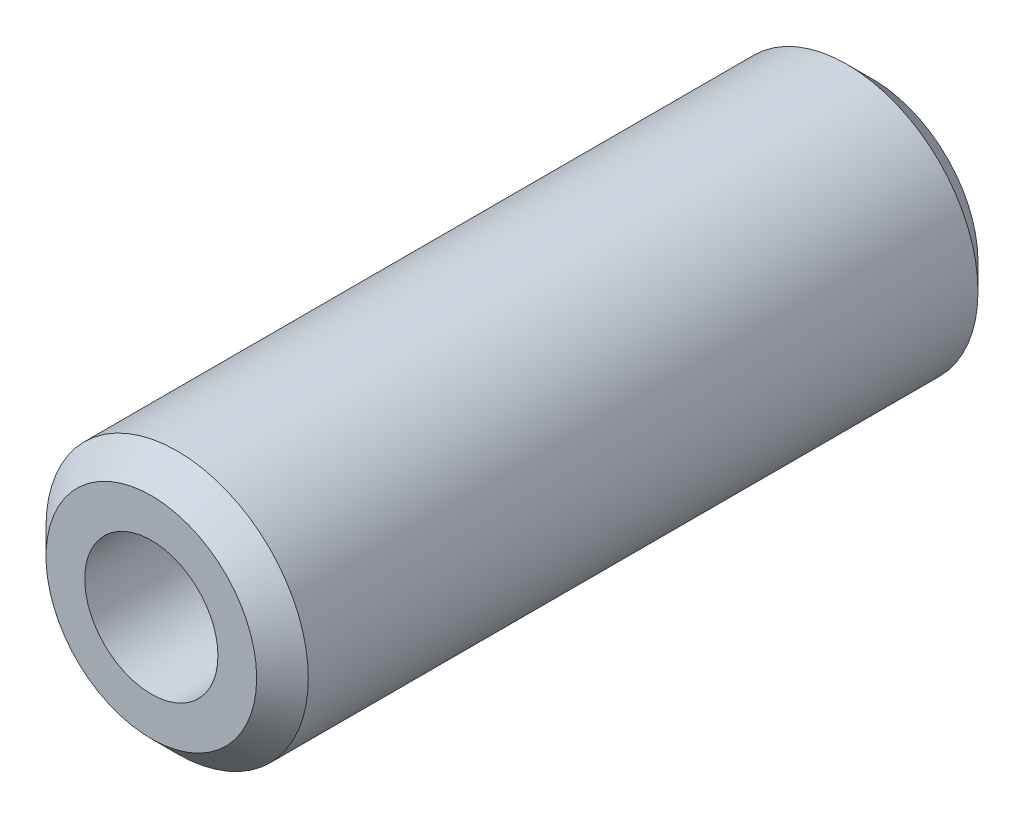
ISO-10303-21;
HEADER;
FILE_DESCRIPTION(('STEP AP214'),'2;1');
FILE_NAME('part.step','',(''),(''),'','','');
FILE_SCHEMA(('AUTOMOTIVE_DESIGN { 1 0 10303 214 1 1 1 1 }'));
ENDSEC;
DATA;
#1=APPLICATION_CONTEXT('core data for automotive mechanical design processes');
#2=APPLICATION_PROTOCOL_DEFINITION('international standard','automotive_design',2000,#1);
#3=PRODUCT_CONTEXT('',#1,'mechanical');
#4=PRODUCT('Part','Part','',(#3));
#5=PRODUCT_RELATED_PRODUCT_CATEGORY('part','',(#4));
#6=PRODUCT_DEFINITION_FORMATION('','',#4);
#7=PRODUCT_DEFINITION_CONTEXT('part definition',#1,'design');
#8=PRODUCT_DEFINITION('design','',#6,#7);
#9=PRODUCT_DEFINITION_SHAPE('','',#8);
#10=(LENGTH_UNIT() NAMED_UNIT(*) SI_UNIT(.MILLI.,.METRE.));
#11=(NAMED_UNIT(*) PLANE_ANGLE_UNIT() SI_UNIT($,.RADIAN.));
#12=(NAMED_UNIT(*) SI_UNIT($,.STERADIAN.) SOLID_ANGLE_UNIT());
#13=UNCERTAINTY_MEASURE_WITH_UNIT(LENGTH_MEASURE(1.E-05),#10,'distance_accuracy_value','');
#14=(GEOMETRIC_REPRESENTATION_CONTEXT(3) GLOBAL_UNCERTAINTY_ASSIGNED_CONTEXT((#13)) GLOBAL_UNIT_ASSIGNED_CONTEXT((#10,
#11,#12)) REPRESENTATION_CONTEXT('',''));
#15=CARTESIAN_POINT('',(0.,0.,0.));
#16=DIRECTION('',(0.,0.,1.));
#17=DIRECTION('',(1.,0.,0.));
#18=AXIS2_PLACEMENT_3D('',#15,#16,#17);
#19=CARTESIAN_POINT('',(0.,0.,34.925));
#20=DIRECTION('',(0.,0.,1.));
#21=DIRECTION('',(1.,0.,0.));
#22=AXIS2_PLACEMENT_3D('',#19,#20,#21);
#23=PLANE('',#22);
#24=CARTESIAN_POINT('',(0.,0.,34.925));
#25=DIRECTION('',(0.,0.,1.));
#26=DIRECTION('',(1.,0.,0.));
#27=AXIS2_PLACEMENT_3D('',#24,#25,#26);
#28=CIRCLE('',#27,10.2);
#29=CARTESIAN_POINT('',(10.2,0.,34.925));
#30=VERTEX_POINT('',#29);
#31=EDGE_CURVE('E10',#30,#30,#28,.T.);
#32=ORIENTED_EDGE('',*,*,#31,.T.);
#33=EDGE_LOOP('',(#32));
#34=FACE_BOUND('',#33,.T.);
#35=CARTESIAN_POINT('',(0.,0.,34.925));
#36=DIRECTION('',(0.,0.,1.));
#37=DIRECTION('',(1.,0.,0.));
#38=AXIS2_PLACEMENT_3D('',#35,#36,#37);
#39=CIRCLE('',#38,6.45);
#40=CARTESIAN_POINT('',(6.45,0.,34.925));
#41=VERTEX_POINT('',#40);
#42=EDGE_CURVE('E72',#41,#41,#39,.T.);
#43=ORIENTED_EDGE('',*,*,#42,.F.);
#44=EDGE_LOOP('',(#43));
#45=FACE_BOUND('',#44,.T.);
#46=ADVANCED_FACE('F45',(#34,#45),#23,.T.);
#47=CARTESIAN_POINT('',(0.,0.,-34.925));
#48=DIRECTION('',(0.,0.,1.));
#49=DIRECTION('',(1.,0.,0.));
#50=AXIS2_PLACEMENT_3D('',#47,#48,#49);
#51=PLANE('',#50);
#52=CARTESIAN_POINT('',(0.,0.,-34.925));
#53=DIRECTION('',(0.,0.,1.));
#54=DIRECTION('',(1.,0.,0.));
#55=AXIS2_PLACEMENT_3D('',#52,#53,#54);
#56=CIRCLE('',#55,10.2);
#57=CARTESIAN_POINT('',(10.2,0.,-34.925));
#58=VERTEX_POINT('',#57);
#59=EDGE_CURVE('E54',#58,#58,#56,.F.);
#60=ORIENTED_EDGE('',*,*,#59,.T.);
#61=EDGE_LOOP('',(#60));
#62=FACE_BOUND('',#61,.T.);
#63=CARTESIAN_POINT('',(0.,0.,-34.925));
#64=DIRECTION('',(0.,0.,1.));
#65=DIRECTION('',(1.,0.,0.));
#66=AXIS2_PLACEMENT_3D('',#63,#64,#65);
#67=CIRCLE('',#66,6.45);
#68=CARTESIAN_POINT('',(6.45,0.,-34.925));
#69=VERTEX_POINT('',#68);
#70=EDGE_CURVE('E73',#69,#69,#67,.T.);
#71=ORIENTED_EDGE('',*,*,#70,.T.);
#72=EDGE_LOOP('',(#71));
#73=FACE_BOUND('',#72,.T.);
#74=ADVANCED_FACE('F86',(#62,#73),#51,.F.);
#75=CARTESIAN_POINT('',(0.,0.,34.925));
#76=DIRECTION('',(0.,0.,-1.));
#77=DIRECTION('',(-1.,0.,0.));
#78=AXIS2_PLACEMENT_3D('',#75,#76,#77);
#79=CYLINDRICAL_SURFACE('',#78,12.7);
#80=CARTESIAN_POINT('',(0.,0.,-32.425));
#81=DIRECTION('',(0.,0.,1.));
#82=DIRECTION('',(1.,0.,0.));
#83=AXIS2_PLACEMENT_3D('',#80,#81,#82);
#84=CIRCLE('',#83,12.7);
#85=CARTESIAN_POINT('',(12.7,0.,-32.425));
#86=VERTEX_POINT('',#85);
#87=EDGE_CURVE('E60',#86,#86,#84,.T.);
#88=ORIENTED_EDGE('',*,*,#87,.T.);
#89=EDGE_LOOP('',(#88));
#90=FACE_BOUND('',#89,.T.);
#91=CARTESIAN_POINT('',(0.,0.,32.425));
#92=DIRECTION('',(0.,0.,1.));
#93=DIRECTION('',(1.,0.,0.));
#94=AXIS2_PLACEMENT_3D('',#91,#92,#93);
#95=CIRCLE('',#94,12.7);
#96=CARTESIAN_POINT('',(12.7,0.,32.425));
#97=VERTEX_POINT('',#96);
#98=EDGE_CURVE('E66',#97,#97,#95,.F.);
#99=ORIENTED_EDGE('',*,*,#98,.T.);
#100=EDGE_LOOP('',(#99));
#101=FACE_BOUND('',#100,.T.);
#102=ADVANCED_FACE('F91',(#90,#101),#79,.T.);
#103=CARTESIAN_POINT('',(0.,0.,34.925));
#104=DIRECTION('',(0.,0.,-1.));
#105=DIRECTION('',(-1.,0.,0.));
#106=AXIS2_PLACEMENT_3D('',#103,#104,#105);
#107=CYLINDRICAL_SURFACE('',#106,6.45);
#108=ORIENTED_EDGE('',*,*,#42,.T.);
#109=EDGE_LOOP('',(#108));
#110=FACE_BOUND('',#109,.T.);
#111=ORIENTED_EDGE('',*,*,#70,.F.);
#112=EDGE_LOOP('',(#111));
#113=FACE_BOUND('',#112,.T.);
#114=ADVANCED_FACE('F82',(#110,#113),#107,.F.);
#115=CARTESIAN_POINT('',(0.,0.,-32.425));
#116=DIRECTION('',(0.,0.,1.));
#117=DIRECTION('',(1.,0.,0.));
#118=AXIS2_PLACEMENT_3D('',#115,#116,#117);
#119=CONICAL_SURFACE('',#118,12.7,0.785398163397449);
#120=ORIENTED_EDGE('',*,*,#59,.F.);
#121=EDGE_LOOP('',(#120));
#122=FACE_BOUND('',#121,.T.);
#123=ORIENTED_EDGE('',*,*,#87,.F.);
#124=EDGE_LOOP('',(#123));
#125=FACE_BOUND('',#124,.T.);
#126=ADVANCED_FACE('F98',(#122,#125),#119,.T.);
#127=CARTESIAN_POINT('',(0.,0.,34.925));
#128=DIRECTION('',(0.,0.,-1.));
#129=DIRECTION('',(-1.,0.,0.));
#130=AXIS2_PLACEMENT_3D('',#127,#128,#129);
#131=CONICAL_SURFACE('',#130,10.2,0.785398163397446);
#132=ORIENTED_EDGE('',*,*,#98,.F.);
#133=EDGE_LOOP('',(#132));
#134=FACE_BOUND('',#133,.T.);
#135=ORIENTED_EDGE('',*,*,#31,.F.);
#136=EDGE_LOOP('',(#135));
#137=FACE_BOUND('',#136,.T.);
#138=ADVANCED_FACE('F48',(#134,#137),#131,.T.);
#139=CLOSED_SHELL('',(#46,#74,#102,#114,#126,#138));
#140=MANIFOLD_SOLID_BREP('B2',#139);
#141=ADVANCED_BREP_SHAPE_REPRESENTATION('',(#18,#140),#14);
#142=SHAPE_DEFINITION_REPRESENTATION(#9,#141);
ENDSEC;
END-ISO-10303-21;
